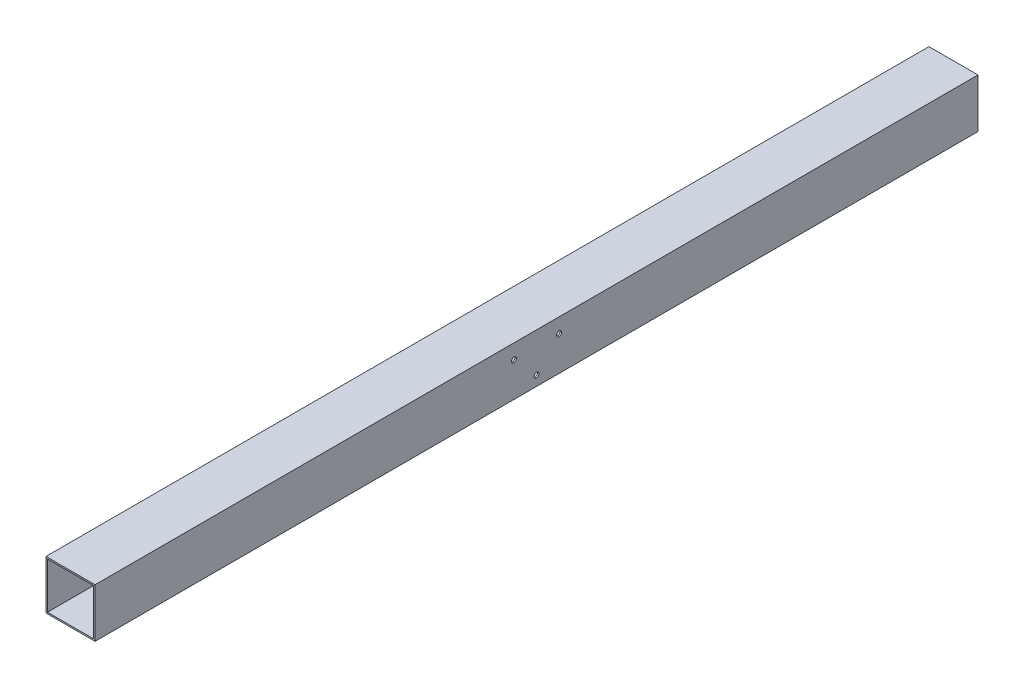
ISO-10303-21;
HEADER;
FILE_DESCRIPTION(('STEP AP214'),'2;1');
FILE_NAME('part.step','',(''),(''),'','','');
FILE_SCHEMA(('AUTOMOTIVE_DESIGN { 1 0 10303 214 1 1 1 1 }'));
ENDSEC;
DATA;
#1=APPLICATION_CONTEXT('core data for automotive mechanical design processes');
#2=APPLICATION_PROTOCOL_DEFINITION('international standard','automotive_design',2000,#1);
#3=PRODUCT_CONTEXT('',#1,'mechanical');
#4=PRODUCT('Part','Part','',(#3));
#5=PRODUCT_RELATED_PRODUCT_CATEGORY('part','',(#4));
#6=PRODUCT_DEFINITION_FORMATION('','',#4);
#7=PRODUCT_DEFINITION_CONTEXT('part definition',#1,'design');
#8=PRODUCT_DEFINITION('design','',#6,#7);
#9=PRODUCT_DEFINITION_SHAPE('','',#8);
#10=(LENGTH_UNIT() NAMED_UNIT(*) SI_UNIT(.MILLI.,.METRE.));
#11=(NAMED_UNIT(*) PLANE_ANGLE_UNIT() SI_UNIT($,.RADIAN.));
#12=(NAMED_UNIT(*) SI_UNIT($,.STERADIAN.) SOLID_ANGLE_UNIT());
#13=UNCERTAINTY_MEASURE_WITH_UNIT(LENGTH_MEASURE(1.E-05),#10,'distance_accuracy_value','');
#14=(GEOMETRIC_REPRESENTATION_CONTEXT(3) GLOBAL_UNCERTAINTY_ASSIGNED_CONTEXT((#13)) GLOBAL_UNIT_ASSIGNED_CONTEXT((#10,
#11,#12)) REPRESENTATION_CONTEXT('',''));
#15=CARTESIAN_POINT('',(0.,0.,0.));
#16=DIRECTION('',(0.,0.,1.));
#17=DIRECTION('',(1.,0.,0.));
#18=AXIS2_PLACEMENT_3D('',#15,#16,#17);
#19=CARTESIAN_POINT('',(0.,0.,900.));
#20=DIRECTION('',(0.,0.,1.));
#21=DIRECTION('',(1.,0.,0.));
#22=AXIS2_PLACEMENT_3D('',#19,#20,#21);
#23=PLANE('',#22);
#24=DIRECTION('',(0.,1.,0.));
#25=VECTOR('',#24,1.);
#26=CARTESIAN_POINT('',(25.,25.,900.));
#27=LINE('',#26,#25);
#28=CARTESIAN_POINT('',(25.,-25.,900.));
#29=VERTEX_POINT('',#28);
#30=CARTESIAN_POINT('',(25.,25.,900.));
#31=VERTEX_POINT('',#30);
#32=EDGE_CURVE('E140',#29,#31,#27,.T.);
#33=ORIENTED_EDGE('',*,*,#32,.T.);
#34=DIRECTION('',(-1.,0.,0.));
#35=VECTOR('',#34,1.);
#36=CARTESIAN_POINT('',(-25.,25.,900.));
#37=LINE('',#36,#35);
#38=CARTESIAN_POINT('',(-25.,25.,900.));
#39=VERTEX_POINT('',#38);
#40=EDGE_CURVE('E143',#31,#39,#37,.T.);
#41=ORIENTED_EDGE('',*,*,#40,.T.);
#42=DIRECTION('',(0.,-1.,0.));
#43=VECTOR('',#42,1.);
#44=CARTESIAN_POINT('',(-25.,25.,900.));
#45=LINE('',#44,#43);
#46=CARTESIAN_POINT('',(-25.,-25.,900.));
#47=VERTEX_POINT('',#46);
#48=EDGE_CURVE('E146',#39,#47,#45,.T.);
#49=ORIENTED_EDGE('',*,*,#48,.T.);
#50=DIRECTION('',(1.,0.,0.));
#51=VECTOR('',#50,1.);
#52=CARTESIAN_POINT('',(-25.,-25.,900.));
#53=LINE('',#52,#51);
#54=EDGE_CURVE('E148',#47,#29,#53,.T.);
#55=ORIENTED_EDGE('',*,*,#54,.T.);
#56=EDGE_LOOP('',(#33,#41,#49,#55));
#57=FACE_BOUND('',#56,.T.);
#58=DIRECTION('',(-1.,0.,0.));
#59=VECTOR('',#58,1.);
#60=CARTESIAN_POINT('',(-23.5,23.5,900.));
#61=LINE('',#60,#59);
#62=CARTESIAN_POINT('',(23.5,23.5,900.));
#63=VERTEX_POINT('',#62);
#64=CARTESIAN_POINT('',(-23.5,23.5,900.));
#65=VERTEX_POINT('',#64);
#66=EDGE_CURVE('E110',#63,#65,#61,.T.);
#67=ORIENTED_EDGE('',*,*,#66,.F.);
#68=DIRECTION('',(0.,1.,0.));
#69=VECTOR('',#68,1.);
#70=CARTESIAN_POINT('',(23.5,23.5,900.));
#71=LINE('',#70,#69);
#72=CARTESIAN_POINT('',(23.5,-23.5,900.));
#73=VERTEX_POINT('',#72);
#74=EDGE_CURVE('E102',#73,#63,#71,.T.);
#75=ORIENTED_EDGE('',*,*,#74,.F.);
#76=DIRECTION('',(1.,0.,0.));
#77=VECTOR('',#76,1.);
#78=CARTESIAN_POINT('',(-23.5,-23.5,900.));
#79=LINE('',#78,#77);
#80=CARTESIAN_POINT('',(-23.5,-23.5,900.));
#81=VERTEX_POINT('',#80);
#82=EDGE_CURVE('E124',#81,#73,#79,.T.);
#83=ORIENTED_EDGE('',*,*,#82,.F.);
#84=DIRECTION('',(0.,-1.,0.));
#85=VECTOR('',#84,1.);
#86=CARTESIAN_POINT('',(-23.5,23.5,900.));
#87=LINE('',#86,#85);
#88=EDGE_CURVE('E122',#65,#81,#87,.T.);
#89=ORIENTED_EDGE('',*,*,#88,.F.);
#90=EDGE_LOOP('',(#67,#75,#83,#89));
#91=FACE_BOUND('',#90,.T.);
#92=ADVANCED_FACE('F35',(#57,#91),#23,.T.);
#93=CARTESIAN_POINT('',(0.,0.,0.));
#94=DIRECTION('',(0.,0.,1.));
#95=DIRECTION('',(1.,0.,0.));
#96=AXIS2_PLACEMENT_3D('',#93,#94,#95);
#97=PLANE('',#96);
#98=DIRECTION('',(0.,1.,0.));
#99=VECTOR('',#98,1.);
#100=CARTESIAN_POINT('',(25.,25.,0.));
#101=LINE('',#100,#99);
#102=CARTESIAN_POINT('',(25.,-25.,0.));
#103=VERTEX_POINT('',#102);
#104=CARTESIAN_POINT('',(25.,25.,0.));
#105=VERTEX_POINT('',#104);
#106=EDGE_CURVE('E118',#103,#105,#101,.T.);
#107=ORIENTED_EDGE('',*,*,#106,.F.);
#108=DIRECTION('',(1.,0.,0.));
#109=VECTOR('',#108,1.);
#110=CARTESIAN_POINT('',(-25.,-25.,0.));
#111=LINE('',#110,#109);
#112=CARTESIAN_POINT('',(-25.,-25.,0.));
#113=VERTEX_POINT('',#112);
#114=EDGE_CURVE('E144',#113,#103,#111,.T.);
#115=ORIENTED_EDGE('',*,*,#114,.F.);
#116=DIRECTION('',(0.,-1.,0.));
#117=VECTOR('',#116,1.);
#118=CARTESIAN_POINT('',(-25.,25.,0.));
#119=LINE('',#118,#117);
#120=CARTESIAN_POINT('',(-25.,25.,0.));
#121=VERTEX_POINT('',#120);
#122=EDGE_CURVE('E155',#121,#113,#119,.T.);
#123=ORIENTED_EDGE('',*,*,#122,.F.);
#124=DIRECTION('',(-1.,0.,0.));
#125=VECTOR('',#124,1.);
#126=CARTESIAN_POINT('',(-25.,25.,0.));
#127=LINE('',#126,#125);
#128=EDGE_CURVE('E153',#105,#121,#127,.T.);
#129=ORIENTED_EDGE('',*,*,#128,.F.);
#130=EDGE_LOOP('',(#107,#115,#123,#129));
#131=FACE_BOUND('',#130,.T.);
#132=DIRECTION('',(0.,1.,0.));
#133=VECTOR('',#132,1.);
#134=CARTESIAN_POINT('',(23.5,23.5,0.));
#135=LINE('',#134,#133);
#136=CARTESIAN_POINT('',(23.5,-23.5,0.));
#137=VERTEX_POINT('',#136);
#138=CARTESIAN_POINT('',(23.5,23.5,0.));
#139=VERTEX_POINT('',#138);
#140=EDGE_CURVE('E60',#137,#139,#135,.T.);
#141=ORIENTED_EDGE('',*,*,#140,.T.);
#142=DIRECTION('',(-1.,0.,0.));
#143=VECTOR('',#142,1.);
#144=CARTESIAN_POINT('',(-23.5,23.5,0.));
#145=LINE('',#144,#143);
#146=CARTESIAN_POINT('',(-23.5,23.5,0.));
#147=VERTEX_POINT('',#146);
#148=EDGE_CURVE('E117',#139,#147,#145,.T.);
#149=ORIENTED_EDGE('',*,*,#148,.T.);
#150=DIRECTION('',(0.,-1.,0.));
#151=VECTOR('',#150,1.);
#152=CARTESIAN_POINT('',(-23.5,23.5,0.));
#153=LINE('',#152,#151);
#154=CARTESIAN_POINT('',(-23.5,-23.5,0.));
#155=VERTEX_POINT('',#154);
#156=EDGE_CURVE('E132',#147,#155,#153,.T.);
#157=ORIENTED_EDGE('',*,*,#156,.T.);
#158=DIRECTION('',(1.,0.,0.));
#159=VECTOR('',#158,1.);
#160=CARTESIAN_POINT('',(-23.5,-23.5,0.));
#161=LINE('',#160,#159);
#162=EDGE_CURVE('E111',#155,#137,#161,.T.);
#163=ORIENTED_EDGE('',*,*,#162,.T.);
#164=EDGE_LOOP('',(#141,#149,#157,#163));
#165=FACE_BOUND('',#164,.T.);
#166=ADVANCED_FACE('F216',(#131,#165),#97,.F.);
#167=CARTESIAN_POINT('',(25.,25.,900.));
#168=DIRECTION('',(-1.,0.,0.));
#169=DIRECTION('',(0.,-1.,0.));
#170=AXIS2_PLACEMENT_3D('',#167,#168,#169);
#171=PLANE('',#170);
#172=CARTESIAN_POINT('',(25.,-15.,450.));
#173=DIRECTION('',(1.,0.,0.));
#174=DIRECTION('',(0.,1.,0.));
#175=AXIS2_PLACEMENT_3D('',#172,#173,#174);
#176=CIRCLE('',#175,2.50000000000002);
#177=CARTESIAN_POINT('',(25.,-12.5,450.));
#178=VERTEX_POINT('',#177);
#179=EDGE_CURVE('E168',#178,#178,#176,.T.);
#180=ORIENTED_EDGE('',*,*,#179,.F.);
#181=EDGE_LOOP('',(#180));
#182=FACE_BOUND('',#181,.T.);
#183=CARTESIAN_POINT('',(25.,10.,427.));
#184=DIRECTION('',(1.,0.,0.));
#185=DIRECTION('',(0.,1.,0.));
#186=AXIS2_PLACEMENT_3D('',#183,#184,#185);
#187=CIRCLE('',#186,2.50000000000002);
#188=CARTESIAN_POINT('',(25.,12.5,427.));
#189=VERTEX_POINT('',#188);
#190=EDGE_CURVE('E281',#189,#189,#187,.T.);
#191=ORIENTED_EDGE('',*,*,#190,.F.);
#192=EDGE_LOOP('',(#191));
#193=FACE_BOUND('',#192,.T.);
#194=CARTESIAN_POINT('',(25.,10.,473.));
#195=DIRECTION('',(1.,0.,0.));
#196=DIRECTION('',(0.,-1.,0.));
#197=AXIS2_PLACEMENT_3D('',#194,#195,#196);
#198=CIRCLE('',#197,2.50000000000002);
#199=CARTESIAN_POINT('',(25.,7.5,473.));
#200=VERTEX_POINT('',#199);
#201=EDGE_CURVE('E279',#200,#200,#198,.T.);
#202=ORIENTED_EDGE('',*,*,#201,.F.);
#203=EDGE_LOOP('',(#202));
#204=FACE_BOUND('',#203,.T.);
#205=ORIENTED_EDGE('',*,*,#106,.T.);
#206=DIRECTION('',(0.,0.,-1.));
#207=VECTOR('',#206,1.);
#208=CARTESIAN_POINT('',(25.,25.,900.));
#209=LINE('',#208,#207);
#210=EDGE_CURVE('E11',#31,#105,#209,.T.);
#211=ORIENTED_EDGE('',*,*,#210,.F.);
#212=ORIENTED_EDGE('',*,*,#32,.F.);
#213=DIRECTION('',(0.,0.,-1.));
#214=VECTOR('',#213,1.);
#215=CARTESIAN_POINT('',(25.,-25.,900.));
#216=LINE('',#215,#214);
#217=EDGE_CURVE('E150',#29,#103,#216,.T.);
#218=ORIENTED_EDGE('',*,*,#217,.T.);
#219=EDGE_LOOP('',(#205,#211,#212,#218));
#220=FACE_BOUND('',#219,.T.);
#221=ADVANCED_FACE('F37',(#182,#193,#204,#220),#171,.F.);
#222=CARTESIAN_POINT('',(-25.,25.,900.));
#223=DIRECTION('',(0.,-1.,0.));
#224=DIRECTION('',(0.,0.,-1.));
#225=AXIS2_PLACEMENT_3D('',#222,#223,#224);
#226=PLANE('',#225);
#227=ORIENTED_EDGE('',*,*,#128,.T.);
#228=DIRECTION('',(0.,0.,-1.));
#229=VECTOR('',#228,1.);
#230=CARTESIAN_POINT('',(-25.,25.,900.));
#231=LINE('',#230,#229);
#232=EDGE_CURVE('E44',#39,#121,#231,.T.);
#233=ORIENTED_EDGE('',*,*,#232,.F.);
#234=ORIENTED_EDGE('',*,*,#40,.F.);
#235=ORIENTED_EDGE('',*,*,#210,.T.);
#236=EDGE_LOOP('',(#227,#233,#234,#235));
#237=FACE_BOUND('',#236,.T.);
#238=ADVANCED_FACE('F232',(#237),#226,.F.);
#239=CARTESIAN_POINT('',(-25.,25.,900.));
#240=DIRECTION('',(1.,0.,0.));
#241=DIRECTION('',(0.,1.,0.));
#242=AXIS2_PLACEMENT_3D('',#239,#240,#241);
#243=PLANE('',#242);
#244=CARTESIAN_POINT('',(-25.,-15.,450.));
#245=DIRECTION('',(1.,0.,0.));
#246=DIRECTION('',(0.,1.,0.));
#247=AXIS2_PLACEMENT_3D('',#244,#245,#246);
#248=CIRCLE('',#247,2.50000000000002);
#249=CARTESIAN_POINT('',(-25.,-12.5,450.));
#250=VERTEX_POINT('',#249);
#251=EDGE_CURVE('E130',#250,#250,#248,.T.);
#252=ORIENTED_EDGE('',*,*,#251,.T.);
#253=EDGE_LOOP('',(#252));
#254=FACE_BOUND('',#253,.T.);
#255=CARTESIAN_POINT('',(-25.,10.,427.));
#256=DIRECTION('',(1.,0.,0.));
#257=DIRECTION('',(0.,1.,0.));
#258=AXIS2_PLACEMENT_3D('',#255,#256,#257);
#259=CIRCLE('',#258,2.50000000000002);
#260=CARTESIAN_POINT('',(-25.,12.5,427.));
#261=VERTEX_POINT('',#260);
#262=EDGE_CURVE('E176',#261,#261,#259,.T.);
#263=ORIENTED_EDGE('',*,*,#262,.T.);
#264=EDGE_LOOP('',(#263));
#265=FACE_BOUND('',#264,.T.);
#266=CARTESIAN_POINT('',(-25.,10.,473.));
#267=DIRECTION('',(1.,0.,0.));
#268=DIRECTION('',(0.,1.,0.));
#269=AXIS2_PLACEMENT_3D('',#266,#267,#268);
#270=CIRCLE('',#269,2.50000000000002);
#271=CARTESIAN_POINT('',(-25.,12.5,473.));
#272=VERTEX_POINT('',#271);
#273=EDGE_CURVE('E172',#272,#272,#270,.T.);
#274=ORIENTED_EDGE('',*,*,#273,.T.);
#275=EDGE_LOOP('',(#274));
#276=FACE_BOUND('',#275,.T.);
#277=ORIENTED_EDGE('',*,*,#122,.T.);
#278=DIRECTION('',(0.,0.,-1.));
#279=VECTOR('',#278,1.);
#280=CARTESIAN_POINT('',(-25.,-25.,900.));
#281=LINE('',#280,#279);
#282=EDGE_CURVE('E160',#47,#113,#281,.T.);
#283=ORIENTED_EDGE('',*,*,#282,.F.);
#284=ORIENTED_EDGE('',*,*,#48,.F.);
#285=ORIENTED_EDGE('',*,*,#232,.T.);
#286=EDGE_LOOP('',(#277,#283,#284,#285));
#287=FACE_BOUND('',#286,.T.);
#288=ADVANCED_FACE('F193',(#254,#265,#276,#287),#243,.F.);
#289=CARTESIAN_POINT('',(-25.,-25.,900.));
#290=DIRECTION('',(0.,1.,0.));
#291=DIRECTION('',(0.,0.,1.));
#292=AXIS2_PLACEMENT_3D('',#289,#290,#291);
#293=PLANE('',#292);
#294=ORIENTED_EDGE('',*,*,#114,.T.);
#295=ORIENTED_EDGE('',*,*,#217,.F.);
#296=ORIENTED_EDGE('',*,*,#54,.F.);
#297=ORIENTED_EDGE('',*,*,#282,.T.);
#298=EDGE_LOOP('',(#294,#295,#296,#297));
#299=FACE_BOUND('',#298,.T.);
#300=ADVANCED_FACE('F227',(#299),#293,.F.);
#301=CARTESIAN_POINT('',(23.5,23.5,900.));
#302=DIRECTION('',(-1.,0.,0.));
#303=DIRECTION('',(0.,-1.,0.));
#304=AXIS2_PLACEMENT_3D('',#301,#302,#303);
#305=PLANE('',#304);
#306=CARTESIAN_POINT('',(23.5,-15.,450.));
#307=DIRECTION('',(-1.,0.,0.));
#308=DIRECTION('',(0.,-1.,0.));
#309=AXIS2_PLACEMENT_3D('',#306,#307,#308);
#310=CIRCLE('',#309,2.50000000000002);
#311=CARTESIAN_POINT('',(23.5,-17.5,450.));
#312=VERTEX_POINT('',#311);
#313=EDGE_CURVE('E188',#312,#312,#310,.T.);
#314=ORIENTED_EDGE('',*,*,#313,.F.);
#315=EDGE_LOOP('',(#314));
#316=FACE_BOUND('',#315,.T.);
#317=CARTESIAN_POINT('',(23.5,10.,427.));
#318=DIRECTION('',(-1.,0.,0.));
#319=DIRECTION('',(0.,-1.,0.));
#320=AXIS2_PLACEMENT_3D('',#317,#318,#319);
#321=CIRCLE('',#320,2.50000000000002);
#322=CARTESIAN_POINT('',(23.5,7.5,427.));
#323=VERTEX_POINT('',#322);
#324=EDGE_CURVE('E171',#323,#323,#321,.T.);
#325=ORIENTED_EDGE('',*,*,#324,.F.);
#326=EDGE_LOOP('',(#325));
#327=FACE_BOUND('',#326,.T.);
#328=CARTESIAN_POINT('',(23.5,10.,473.));
#329=DIRECTION('',(-1.,0.,0.));
#330=DIRECTION('',(0.,-1.,0.));
#331=AXIS2_PLACEMENT_3D('',#328,#329,#330);
#332=CIRCLE('',#331,2.50000000000002);
#333=CARTESIAN_POINT('',(23.5,7.5,473.));
#334=VERTEX_POINT('',#333);
#335=EDGE_CURVE('E167',#334,#334,#332,.T.);
#336=ORIENTED_EDGE('',*,*,#335,.F.);
#337=EDGE_LOOP('',(#336));
#338=FACE_BOUND('',#337,.T.);
#339=ORIENTED_EDGE('',*,*,#140,.F.);
#340=DIRECTION('',(0.,0.,-1.));
#341=VECTOR('',#340,1.);
#342=CARTESIAN_POINT('',(23.5,-23.5,900.));
#343=LINE('',#342,#341);
#344=EDGE_CURVE('E106',#73,#137,#343,.T.);
#345=ORIENTED_EDGE('',*,*,#344,.F.);
#346=ORIENTED_EDGE('',*,*,#74,.T.);
#347=DIRECTION('',(0.,0.,-1.));
#348=VECTOR('',#347,1.);
#349=CARTESIAN_POINT('',(23.5,23.5,900.));
#350=LINE('',#349,#348);
#351=EDGE_CURVE('E105',#63,#139,#350,.T.);
#352=ORIENTED_EDGE('',*,*,#351,.T.);
#353=EDGE_LOOP('',(#339,#345,#346,#352));
#354=FACE_BOUND('',#353,.T.);
#355=ADVANCED_FACE('F104',(#316,#327,#338,#354),#305,.T.);
#356=CARTESIAN_POINT('',(-23.5,23.5,900.));
#357=DIRECTION('',(0.,-1.,0.));
#358=DIRECTION('',(0.,0.,-1.));
#359=AXIS2_PLACEMENT_3D('',#356,#357,#358);
#360=PLANE('',#359);
#361=ORIENTED_EDGE('',*,*,#148,.F.);
#362=ORIENTED_EDGE('',*,*,#351,.F.);
#363=ORIENTED_EDGE('',*,*,#66,.T.);
#364=DIRECTION('',(0.,0.,-1.));
#365=VECTOR('',#364,1.);
#366=CARTESIAN_POINT('',(-23.5,23.5,900.));
#367=LINE('',#366,#365);
#368=EDGE_CURVE('E119',#65,#147,#367,.T.);
#369=ORIENTED_EDGE('',*,*,#368,.T.);
#370=EDGE_LOOP('',(#361,#362,#363,#369));
#371=FACE_BOUND('',#370,.T.);
#372=ADVANCED_FACE('F114',(#371),#360,.T.);
#373=CARTESIAN_POINT('',(-23.5,23.5,900.));
#374=DIRECTION('',(1.,0.,0.));
#375=DIRECTION('',(0.,1.,0.));
#376=AXIS2_PLACEMENT_3D('',#373,#374,#375);
#377=PLANE('',#376);
#378=CARTESIAN_POINT('',(-23.5,-15.,450.));
#379=DIRECTION('',(1.,0.,0.));
#380=DIRECTION('',(0.,1.,0.));
#381=AXIS2_PLACEMENT_3D('',#378,#379,#380);
#382=CIRCLE('',#381,2.50000000000002);
#383=CARTESIAN_POINT('',(-23.5,-12.5,450.));
#384=VERTEX_POINT('',#383);
#385=EDGE_CURVE('E39',#384,#384,#382,.T.);
#386=ORIENTED_EDGE('',*,*,#385,.F.);
#387=EDGE_LOOP('',(#386));
#388=FACE_BOUND('',#387,.T.);
#389=CARTESIAN_POINT('',(-23.5,10.,427.));
#390=DIRECTION('',(1.,0.,0.));
#391=DIRECTION('',(0.,1.,0.));
#392=AXIS2_PLACEMENT_3D('',#389,#390,#391);
#393=CIRCLE('',#392,2.50000000000002);
#394=CARTESIAN_POINT('',(-23.5,12.5,427.));
#395=VERTEX_POINT('',#394);
#396=EDGE_CURVE('E169',#395,#395,#393,.T.);
#397=ORIENTED_EDGE('',*,*,#396,.F.);
#398=EDGE_LOOP('',(#397));
#399=FACE_BOUND('',#398,.T.);
#400=CARTESIAN_POINT('',(-23.5,10.,473.));
#401=DIRECTION('',(1.,0.,0.));
#402=DIRECTION('',(0.,1.,0.));
#403=AXIS2_PLACEMENT_3D('',#400,#401,#402);
#404=CIRCLE('',#403,2.50000000000002);
#405=CARTESIAN_POINT('',(-23.5,12.5,473.));
#406=VERTEX_POINT('',#405);
#407=EDGE_CURVE('E165',#406,#406,#404,.T.);
#408=ORIENTED_EDGE('',*,*,#407,.F.);
#409=EDGE_LOOP('',(#408));
#410=FACE_BOUND('',#409,.T.);
#411=ORIENTED_EDGE('',*,*,#156,.F.);
#412=ORIENTED_EDGE('',*,*,#368,.F.);
#413=ORIENTED_EDGE('',*,*,#88,.T.);
#414=DIRECTION('',(0.,0.,-1.));
#415=VECTOR('',#414,1.);
#416=CARTESIAN_POINT('',(-23.5,-23.5,900.));
#417=LINE('',#416,#415);
#418=EDGE_CURVE('E52',#81,#155,#417,.T.);
#419=ORIENTED_EDGE('',*,*,#418,.T.);
#420=EDGE_LOOP('',(#411,#412,#413,#419));
#421=FACE_BOUND('',#420,.T.);
#422=ADVANCED_FACE('F255',(#388,#399,#410,#421),#377,.T.);
#423=CARTESIAN_POINT('',(-23.5,-23.5,900.));
#424=DIRECTION('',(0.,1.,0.));
#425=DIRECTION('',(0.,0.,1.));
#426=AXIS2_PLACEMENT_3D('',#423,#424,#425);
#427=PLANE('',#426);
#428=ORIENTED_EDGE('',*,*,#162,.F.);
#429=ORIENTED_EDGE('',*,*,#418,.F.);
#430=ORIENTED_EDGE('',*,*,#82,.T.);
#431=ORIENTED_EDGE('',*,*,#344,.T.);
#432=EDGE_LOOP('',(#428,#429,#430,#431));
#433=FACE_BOUND('',#432,.T.);
#434=ADVANCED_FACE('F253',(#433),#427,.T.);
#435=CARTESIAN_POINT('',(-34.,10.,473.));
#436=DIRECTION('',(1.,0.,0.));
#437=DIRECTION('',(0.,1.,0.));
#438=AXIS2_PLACEMENT_3D('',#435,#436,#437);
#439=CYLINDRICAL_SURFACE('',#438,2.50000000000002);
#440=ORIENTED_EDGE('',*,*,#407,.T.);
#441=EDGE_LOOP('',(#440));
#442=FACE_BOUND('',#441,.T.);
#443=ORIENTED_EDGE('',*,*,#273,.F.);
#444=EDGE_LOOP('',(#443));
#445=FACE_BOUND('',#444,.T.);
#446=ADVANCED_FACE('F210',(#442,#445),#439,.F.);
#447=CARTESIAN_POINT('',(-34.,10.,427.));
#448=DIRECTION('',(1.,0.,0.));
#449=DIRECTION('',(0.,1.,0.));
#450=AXIS2_PLACEMENT_3D('',#447,#448,#449);
#451=CYLINDRICAL_SURFACE('',#450,2.50000000000002);
#452=ORIENTED_EDGE('',*,*,#396,.T.);
#453=EDGE_LOOP('',(#452));
#454=FACE_BOUND('',#453,.T.);
#455=ORIENTED_EDGE('',*,*,#262,.F.);
#456=EDGE_LOOP('',(#455));
#457=FACE_BOUND('',#456,.T.);
#458=ADVANCED_FACE('F199',(#454,#457),#451,.F.);
#459=CARTESIAN_POINT('',(-34.,-15.,450.));
#460=DIRECTION('',(1.,0.,0.));
#461=DIRECTION('',(0.,1.,0.));
#462=AXIS2_PLACEMENT_3D('',#459,#460,#461);
#463=CYLINDRICAL_SURFACE('',#462,2.50000000000002);
#464=ORIENTED_EDGE('',*,*,#385,.T.);
#465=EDGE_LOOP('',(#464));
#466=FACE_BOUND('',#465,.T.);
#467=ORIENTED_EDGE('',*,*,#251,.F.);
#468=EDGE_LOOP('',(#467));
#469=FACE_BOUND('',#468,.T.);
#470=ADVANCED_FACE('F196',(#466,#469),#463,.F.);
#471=ORIENTED_EDGE('',*,*,#335,.T.);
#472=EDGE_LOOP('',(#471));
#473=FACE_BOUND('',#472,.T.);
#474=ORIENTED_EDGE('',*,*,#201,.T.);
#475=EDGE_LOOP('',(#474));
#476=FACE_BOUND('',#475,.T.);
#477=ADVANCED_FACE('F198',(#473,#476),#439,.F.);
#478=ORIENTED_EDGE('',*,*,#324,.T.);
#479=EDGE_LOOP('',(#478));
#480=FACE_BOUND('',#479,.T.);
#481=ORIENTED_EDGE('',*,*,#190,.T.);
#482=EDGE_LOOP('',(#481));
#483=FACE_BOUND('',#482,.T.);
#484=ADVANCED_FACE('F207',(#480,#483),#451,.F.);
#485=ORIENTED_EDGE('',*,*,#313,.T.);
#486=EDGE_LOOP('',(#485));
#487=FACE_BOUND('',#486,.T.);
#488=ORIENTED_EDGE('',*,*,#179,.T.);
#489=EDGE_LOOP('',(#488));
#490=FACE_BOUND('',#489,.T.);
#491=ADVANCED_FACE('F202',(#487,#490),#463,.F.);
#492=CLOSED_SHELL('',(#92,#166,#221,#238,#288,#300,#355,#372,#422,#434,#446,#458,#470,#477,#484,#491));
#493=MANIFOLD_SOLID_BREP('B2',#492);
#494=ADVANCED_BREP_SHAPE_REPRESENTATION('',(#18,#493),#14);
#495=SHAPE_DEFINITION_REPRESENTATION(#9,#494);
ENDSEC;
END-ISO-10303-21;
